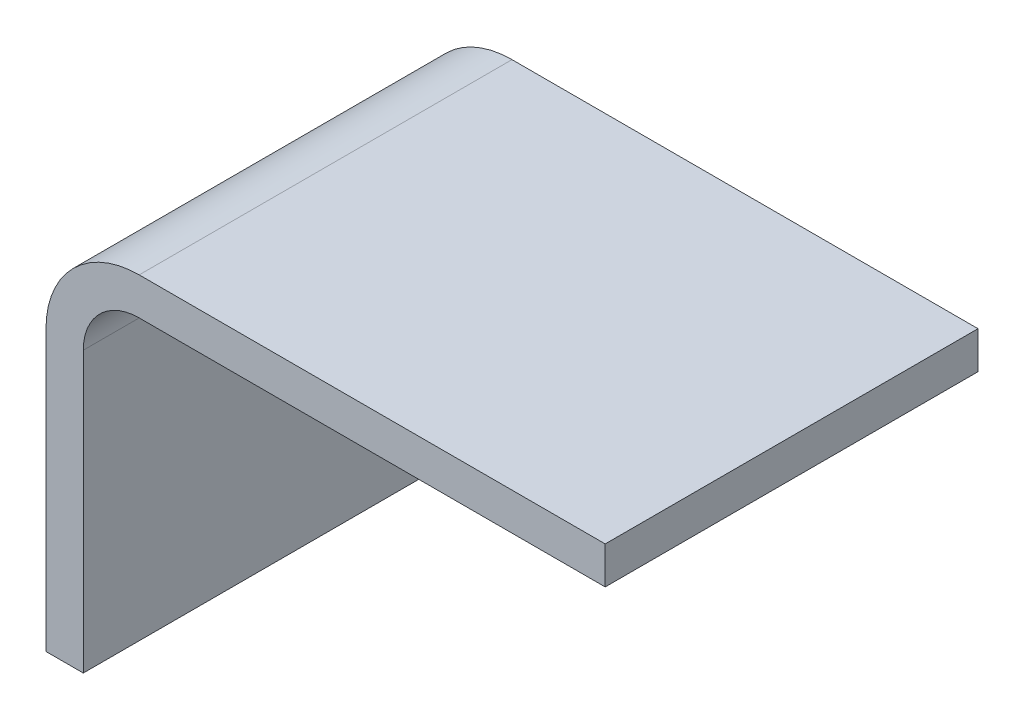
ISO-10303-21;
HEADER;
FILE_DESCRIPTION(('STEP AP214'),'2;1');
FILE_NAME('part.step','',(''),(''),'','','');
FILE_SCHEMA(('AUTOMOTIVE_DESIGN { 1 0 10303 214 1 1 1 1 }'));
ENDSEC;
DATA;
#1=APPLICATION_CONTEXT('core data for automotive mechanical design processes');
#2=APPLICATION_PROTOCOL_DEFINITION('international standard','automotive_design',2000,#1);
#3=PRODUCT_CONTEXT('',#1,'mechanical');
#4=PRODUCT('Part','Part','',(#3));
#5=PRODUCT_RELATED_PRODUCT_CATEGORY('part','',(#4));
#6=PRODUCT_DEFINITION_FORMATION('','',#4);
#7=PRODUCT_DEFINITION_CONTEXT('part definition',#1,'design');
#8=PRODUCT_DEFINITION('design','',#6,#7);
#9=PRODUCT_DEFINITION_SHAPE('','',#8);
#10=(LENGTH_UNIT() NAMED_UNIT(*) SI_UNIT(.MILLI.,.METRE.));
#11=(NAMED_UNIT(*) PLANE_ANGLE_UNIT() SI_UNIT($,.RADIAN.));
#12=(NAMED_UNIT(*) SI_UNIT($,.STERADIAN.) SOLID_ANGLE_UNIT());
#13=UNCERTAINTY_MEASURE_WITH_UNIT(LENGTH_MEASURE(1.E-05),#10,'distance_accuracy_value','');
#14=(GEOMETRIC_REPRESENTATION_CONTEXT(3) GLOBAL_UNCERTAINTY_ASSIGNED_CONTEXT((#13)) GLOBAL_UNIT_ASSIGNED_CONTEXT((#10,
#11,#12)) REPRESENTATION_CONTEXT('',''));
#15=CARTESIAN_POINT('',(0.,0.,0.));
#16=DIRECTION('',(0.,0.,1.));
#17=DIRECTION('',(1.,0.,0.));
#18=AXIS2_PLACEMENT_3D('',#15,#16,#17);
#19=CARTESIAN_POINT('',(0.,0.,0.));
#20=DIRECTION('',(0.,1.,0.));
#21=DIRECTION('',(0.,0.,1.));
#22=AXIS2_PLACEMENT_3D('',#19,#20,#21);
#23=PLANE('',#22);
#24=DIRECTION('',(0.,0.,-1.));
#25=VECTOR('',#24,1.);
#26=CARTESIAN_POINT('',(-190.5,0.,-127.));
#27=LINE('',#26,#25);
#28=CARTESIAN_POINT('',(-190.5,0.,0.));
#29=VERTEX_POINT('',#28);
#30=CARTESIAN_POINT('',(-190.5,0.,-127.));
#31=VERTEX_POINT('',#30);
#32=EDGE_CURVE('E43',#29,#31,#27,.T.);
#33=ORIENTED_EDGE('',*,*,#32,.T.);
#34=DIRECTION('',(1.,0.,0.));
#35=VECTOR('',#34,1.);
#36=CARTESIAN_POINT('',(0.,0.,-127.));
#37=LINE('',#36,#35);
#38=CARTESIAN_POINT('',(-177.8,0.,-127.));
#39=VERTEX_POINT('',#38);
#40=EDGE_CURVE('E159',#31,#39,#37,.T.);
#41=ORIENTED_EDGE('',*,*,#40,.T.);
#42=DIRECTION('',(0.,0.,1.));
#43=VECTOR('',#42,1.);
#44=CARTESIAN_POINT('',(-177.8,0.,-127.));
#45=LINE('',#44,#43);
#46=CARTESIAN_POINT('',(-177.8,0.,0.));
#47=VERTEX_POINT('',#46);
#48=EDGE_CURVE('E11',#39,#47,#45,.T.);
#49=ORIENTED_EDGE('',*,*,#48,.T.);
#50=DIRECTION('',(1.,0.,0.));
#51=VECTOR('',#50,1.);
#52=CARTESIAN_POINT('',(0.,0.,0.));
#53=LINE('',#52,#51);
#54=EDGE_CURVE('E55',#29,#47,#53,.T.);
#55=ORIENTED_EDGE('',*,*,#54,.F.);
#56=EDGE_LOOP('',(#33,#41,#49,#55));
#57=FACE_BOUND('',#56,.T.);
#58=ADVANCED_FACE('F39',(#57),#23,.F.);
#59=CARTESIAN_POINT('',(0.,0.,0.));
#60=DIRECTION('',(1.,0.,0.));
#61=DIRECTION('',(0.,0.,-1.));
#62=AXIS2_PLACEMENT_3D('',#59,#60,#61);
#63=PLANE('',#62);
#64=DIRECTION('',(0.,0.,-1.));
#65=VECTOR('',#64,1.);
#66=CARTESIAN_POINT('',(0.,127.,-127.));
#67=LINE('',#66,#65);
#68=CARTESIAN_POINT('',(0.,127.,0.));
#69=VERTEX_POINT('',#68);
#70=CARTESIAN_POINT('',(0.,127.,-127.));
#71=VERTEX_POINT('',#70);
#72=EDGE_CURVE('E154',#69,#71,#67,.T.);
#73=ORIENTED_EDGE('',*,*,#72,.F.);
#74=DIRECTION('',(0.,-1.,0.));
#75=VECTOR('',#74,1.);
#76=CARTESIAN_POINT('',(0.,0.,0.));
#77=LINE('',#76,#75);
#78=CARTESIAN_POINT('',(0.,114.3,0.));
#79=VERTEX_POINT('',#78);
#80=EDGE_CURVE('E156',#69,#79,#77,.T.);
#81=ORIENTED_EDGE('',*,*,#80,.T.);
#82=DIRECTION('',(0.,0.,1.));
#83=VECTOR('',#82,1.);
#84=CARTESIAN_POINT('',(0.,114.3,-127.));
#85=LINE('',#84,#83);
#86=CARTESIAN_POINT('',(0.,114.3,-127.));
#87=VERTEX_POINT('',#86);
#88=EDGE_CURVE('E153',#87,#79,#85,.T.);
#89=ORIENTED_EDGE('',*,*,#88,.F.);
#90=DIRECTION('',(0.,-1.,0.));
#91=VECTOR('',#90,1.);
#92=CARTESIAN_POINT('',(0.,0.,-127.));
#93=LINE('',#92,#91);
#94=EDGE_CURVE('E160',#71,#87,#93,.T.);
#95=ORIENTED_EDGE('',*,*,#94,.F.);
#96=EDGE_LOOP('',(#73,#81,#89,#95));
#97=FACE_BOUND('',#96,.T.);
#98=ADVANCED_FACE('F41',(#97),#63,.T.);
#99=CARTESIAN_POINT('',(0.,0.,-127.));
#100=DIRECTION('',(0.,0.,-1.));
#101=DIRECTION('',(-1.,0.,0.));
#102=AXIS2_PLACEMENT_3D('',#99,#100,#101);
#103=PLANE('',#102);
#104=DIRECTION('',(-1.,0.,0.));
#105=VECTOR('',#104,1.);
#106=CARTESIAN_POINT('',(-190.5,127.,-127.));
#107=LINE('',#106,#105);
#108=CARTESIAN_POINT('',(-158.75,127.,-127.));
#109=VERTEX_POINT('',#108);
#110=EDGE_CURVE('E135',#71,#109,#107,.T.);
#111=ORIENTED_EDGE('',*,*,#110,.F.);
#112=ORIENTED_EDGE('',*,*,#94,.T.);
#113=DIRECTION('',(1.,0.,0.));
#114=VECTOR('',#113,1.);
#115=CARTESIAN_POINT('',(-158.75,114.3,-127.));
#116=LINE('',#115,#114);
#117=CARTESIAN_POINT('',(-158.75,114.3,-127.));
#118=VERTEX_POINT('',#117);
#119=EDGE_CURVE('E125',#118,#87,#116,.T.);
#120=ORIENTED_EDGE('',*,*,#119,.F.);
#121=CARTESIAN_POINT('',(-158.75,95.25,-127.));
#122=DIRECTION('',(0.,0.,-1.));
#123=DIRECTION('',(-1.,0.,0.));
#124=AXIS2_PLACEMENT_3D('',#121,#122,#123);
#125=CIRCLE('',#124,19.05);
#126=CARTESIAN_POINT('',(-177.8,95.25,-127.));
#127=VERTEX_POINT('',#126);
#128=EDGE_CURVE('E109',#127,#118,#125,.T.);
#129=ORIENTED_EDGE('',*,*,#128,.F.);
#130=DIRECTION('',(0.,1.,0.));
#131=VECTOR('',#130,1.);
#132=CARTESIAN_POINT('',(-177.8,-107.95,-127.));
#133=LINE('',#132,#131);
#134=EDGE_CURVE('E102',#39,#127,#133,.T.);
#135=ORIENTED_EDGE('',*,*,#134,.F.);
#136=ORIENTED_EDGE('',*,*,#40,.F.);
#137=DIRECTION('',(0.,-1.,0.));
#138=VECTOR('',#137,1.);
#139=CARTESIAN_POINT('',(-190.5,-127.,-127.));
#140=LINE('',#139,#138);
#141=CARTESIAN_POINT('',(-190.5,95.25,-127.));
#142=VERTEX_POINT('',#141);
#143=EDGE_CURVE('E137',#142,#31,#140,.T.);
#144=ORIENTED_EDGE('',*,*,#143,.F.);
#145=CARTESIAN_POINT('',(-158.75,95.25,-127.));
#146=DIRECTION('',(0.,0.,-1.));
#147=DIRECTION('',(-1.,0.,0.));
#148=AXIS2_PLACEMENT_3D('',#145,#146,#147);
#149=CIRCLE('',#148,31.75);
#150=EDGE_CURVE('E145',#142,#109,#149,.T.);
#151=ORIENTED_EDGE('',*,*,#150,.T.);
#152=EDGE_LOOP('',(#111,#112,#120,#129,#135,#136,#144,#151));
#153=FACE_BOUND('',#152,.T.);
#154=ADVANCED_FACE('F122',(#153),#103,.T.);
#155=CARTESIAN_POINT('',(0.,0.,0.));
#156=DIRECTION('',(0.,0.,-1.));
#157=DIRECTION('',(-1.,0.,0.));
#158=AXIS2_PLACEMENT_3D('',#155,#156,#157);
#159=PLANE('',#158);
#160=ORIENTED_EDGE('',*,*,#80,.F.);
#161=DIRECTION('',(-1.,0.,0.));
#162=VECTOR('',#161,1.);
#163=CARTESIAN_POINT('',(-190.5,127.,0.));
#164=LINE('',#163,#162);
#165=CARTESIAN_POINT('',(-158.75,127.,0.));
#166=VERTEX_POINT('',#165);
#167=EDGE_CURVE('E117',#69,#166,#164,.T.);
#168=ORIENTED_EDGE('',*,*,#167,.T.);
#169=CARTESIAN_POINT('',(-158.75,95.25,0.));
#170=DIRECTION('',(0.,0.,-1.));
#171=DIRECTION('',(-1.,0.,0.));
#172=AXIS2_PLACEMENT_3D('',#169,#170,#171);
#173=CIRCLE('',#172,31.75);
#174=CARTESIAN_POINT('',(-190.5,95.25,0.));
#175=VERTEX_POINT('',#174);
#176=EDGE_CURVE('E141',#166,#175,#173,.F.);
#177=ORIENTED_EDGE('',*,*,#176,.T.);
#178=DIRECTION('',(0.,-1.,0.));
#179=VECTOR('',#178,1.);
#180=CARTESIAN_POINT('',(-190.5,-127.,0.));
#181=LINE('',#180,#179);
#182=EDGE_CURVE('E138',#175,#29,#181,.T.);
#183=ORIENTED_EDGE('',*,*,#182,.T.);
#184=ORIENTED_EDGE('',*,*,#54,.T.);
#185=DIRECTION('',(0.,1.,0.));
#186=VECTOR('',#185,1.);
#187=CARTESIAN_POINT('',(-177.8,-107.95,0.));
#188=LINE('',#187,#186);
#189=CARTESIAN_POINT('',(-177.8,95.25,0.));
#190=VERTEX_POINT('',#189);
#191=EDGE_CURVE('E129',#47,#190,#188,.T.);
#192=ORIENTED_EDGE('',*,*,#191,.T.);
#193=CARTESIAN_POINT('',(-158.75,95.25,0.));
#194=DIRECTION('',(0.,0.,-1.));
#195=DIRECTION('',(-1.,0.,0.));
#196=AXIS2_PLACEMENT_3D('',#193,#194,#195);
#197=CIRCLE('',#196,19.05);
#198=CARTESIAN_POINT('',(-158.75,114.3,0.));
#199=VERTEX_POINT('',#198);
#200=EDGE_CURVE('E116',#190,#199,#197,.T.);
#201=ORIENTED_EDGE('',*,*,#200,.T.);
#202=DIRECTION('',(1.,0.,0.));
#203=VECTOR('',#202,1.);
#204=CARTESIAN_POINT('',(-158.75,114.3,0.));
#205=LINE('',#204,#203);
#206=EDGE_CURVE('E110',#199,#79,#205,.T.);
#207=ORIENTED_EDGE('',*,*,#206,.T.);
#208=EDGE_LOOP('',(#160,#168,#177,#183,#184,#192,#201,#207));
#209=FACE_BOUND('',#208,.T.);
#210=ADVANCED_FACE('F183',(#209),#159,.F.);
#211=CARTESIAN_POINT('',(-190.5,127.,-127.));
#212=DIRECTION('',(0.,1.,0.));
#213=DIRECTION('',(0.,0.,1.));
#214=AXIS2_PLACEMENT_3D('',#211,#212,#213);
#215=PLANE('',#214);
#216=ORIENTED_EDGE('',*,*,#167,.F.);
#217=ORIENTED_EDGE('',*,*,#72,.T.);
#218=ORIENTED_EDGE('',*,*,#110,.T.);
#219=DIRECTION('',(0.,0.,1.));
#220=VECTOR('',#219,1.);
#221=CARTESIAN_POINT('',(-158.75,127.,-127.));
#222=LINE('',#221,#220);
#223=EDGE_CURVE('E148',#109,#166,#222,.T.);
#224=ORIENTED_EDGE('',*,*,#223,.T.);
#225=EDGE_LOOP('',(#216,#217,#218,#224));
#226=FACE_BOUND('',#225,.T.);
#227=ADVANCED_FACE('F176',(#226),#215,.T.);
#228=CARTESIAN_POINT('',(-158.75,114.3,-127.));
#229=DIRECTION('',(0.,-1.,0.));
#230=DIRECTION('',(0.,0.,-1.));
#231=AXIS2_PLACEMENT_3D('',#228,#229,#230);
#232=PLANE('',#231);
#233=ORIENTED_EDGE('',*,*,#119,.T.);
#234=ORIENTED_EDGE('',*,*,#88,.T.);
#235=ORIENTED_EDGE('',*,*,#206,.F.);
#236=DIRECTION('',(0.,0.,1.));
#237=VECTOR('',#236,1.);
#238=CARTESIAN_POINT('',(-158.75,114.3,-127.));
#239=LINE('',#238,#237);
#240=EDGE_CURVE('E118',#118,#199,#239,.T.);
#241=ORIENTED_EDGE('',*,*,#240,.F.);
#242=EDGE_LOOP('',(#233,#234,#235,#241));
#243=FACE_BOUND('',#242,.T.);
#244=ADVANCED_FACE('F180',(#243),#232,.T.);
#245=CARTESIAN_POINT('',(-190.5,-127.,-127.));
#246=DIRECTION('',(-1.,0.,0.));
#247=DIRECTION('',(0.,0.,1.));
#248=AXIS2_PLACEMENT_3D('',#245,#246,#247);
#249=PLANE('',#248);
#250=ORIENTED_EDGE('',*,*,#32,.F.);
#251=ORIENTED_EDGE('',*,*,#182,.F.);
#252=DIRECTION('',(0.,0.,1.));
#253=VECTOR('',#252,1.);
#254=CARTESIAN_POINT('',(-190.5,95.25,-127.));
#255=LINE('',#254,#253);
#256=EDGE_CURVE('E151',#175,#142,#255,.F.);
#257=ORIENTED_EDGE('',*,*,#256,.T.);
#258=ORIENTED_EDGE('',*,*,#143,.T.);
#259=EDGE_LOOP('',(#250,#251,#257,#258));
#260=FACE_BOUND('',#259,.T.);
#261=ADVANCED_FACE('F200',(#260),#249,.T.);
#262=CARTESIAN_POINT('',(-158.75,95.25,-127.));
#263=DIRECTION('',(0.,0.,1.));
#264=DIRECTION('',(1.,0.,0.));
#265=AXIS2_PLACEMENT_3D('',#262,#263,#264);
#266=CYLINDRICAL_SURFACE('',#265,31.75);
#267=ORIENTED_EDGE('',*,*,#150,.F.);
#268=ORIENTED_EDGE('',*,*,#256,.F.);
#269=ORIENTED_EDGE('',*,*,#176,.F.);
#270=ORIENTED_EDGE('',*,*,#223,.F.);
#271=EDGE_LOOP('',(#267,#268,#269,#270));
#272=FACE_BOUND('',#271,.T.);
#273=ADVANCED_FACE('F172',(#272),#266,.T.);
#274=CARTESIAN_POINT('',(-177.8,-107.95,-127.));
#275=DIRECTION('',(1.,0.,0.));
#276=DIRECTION('',(0.,1.,0.));
#277=AXIS2_PLACEMENT_3D('',#274,#275,#276);
#278=PLANE('',#277);
#279=ORIENTED_EDGE('',*,*,#48,.F.);
#280=ORIENTED_EDGE('',*,*,#134,.T.);
#281=DIRECTION('',(0.,0.,1.));
#282=VECTOR('',#281,1.);
#283=CARTESIAN_POINT('',(-177.8,95.25,-127.));
#284=LINE('',#283,#282);
#285=EDGE_CURVE('E105',#127,#190,#284,.T.);
#286=ORIENTED_EDGE('',*,*,#285,.T.);
#287=ORIENTED_EDGE('',*,*,#191,.F.);
#288=EDGE_LOOP('',(#279,#280,#286,#287));
#289=FACE_BOUND('',#288,.T.);
#290=ADVANCED_FACE('F104',(#289),#278,.T.);
#291=CARTESIAN_POINT('',(-158.75,95.25,-127.));
#292=DIRECTION('',(0.,0.,1.));
#293=DIRECTION('',(1.,0.,0.));
#294=AXIS2_PLACEMENT_3D('',#291,#292,#293);
#295=CYLINDRICAL_SURFACE('',#294,19.05);
#296=ORIENTED_EDGE('',*,*,#200,.F.);
#297=ORIENTED_EDGE('',*,*,#285,.F.);
#298=ORIENTED_EDGE('',*,*,#128,.T.);
#299=ORIENTED_EDGE('',*,*,#240,.T.);
#300=EDGE_LOOP('',(#296,#297,#298,#299));
#301=FACE_BOUND('',#300,.T.);
#302=ADVANCED_FACE('F113',(#301),#295,.F.);
#303=CLOSED_SHELL('',(#58,#98,#154,#210,#227,#244,#261,#273,#290,#302));
#304=MANIFOLD_SOLID_BREP('B2',#303);
#305=ADVANCED_BREP_SHAPE_REPRESENTATION('',(#18,#304),#14);
#306=SHAPE_DEFINITION_REPRESENTATION(#9,#305);
ENDSEC;
END-ISO-10303-21;
